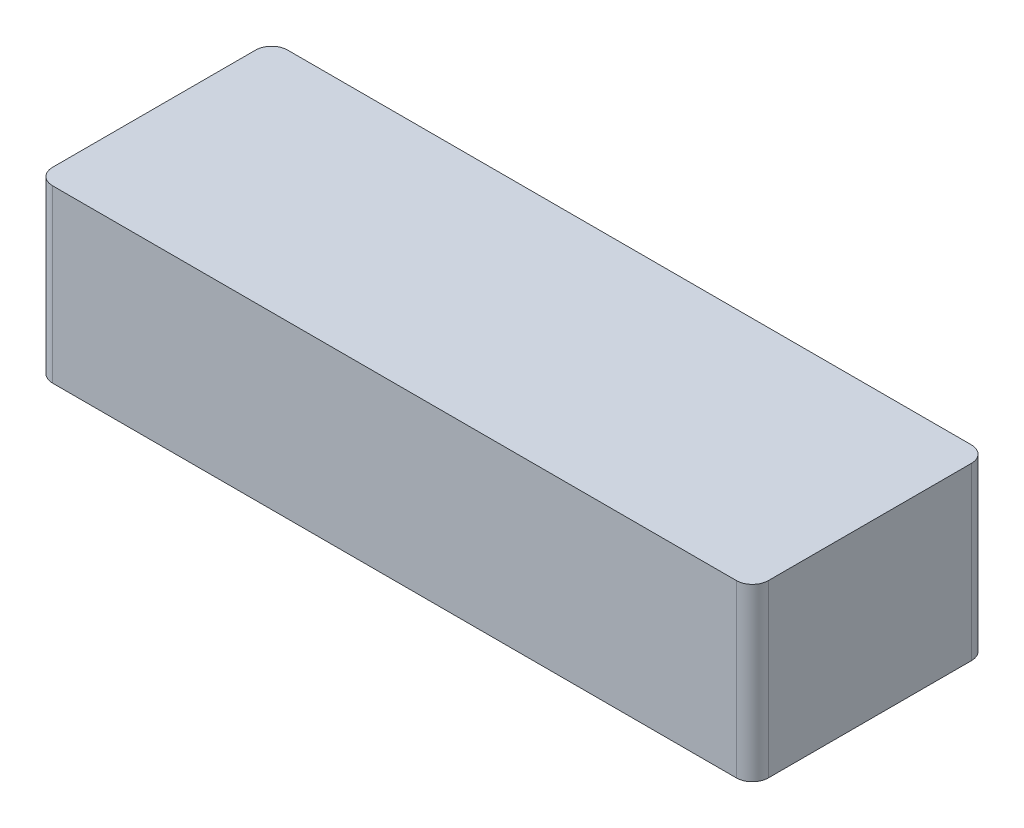
ISO-10303-21;
HEADER;
FILE_DESCRIPTION(('STEP AP214'),'2;1');
FILE_NAME('part.step','',(''),(''),'','','');
FILE_SCHEMA(('AUTOMOTIVE_DESIGN { 1 0 10303 214 1 1 1 1 }'));
ENDSEC;
DATA;
#1=APPLICATION_CONTEXT('core data for automotive mechanical design processes');
#2=APPLICATION_PROTOCOL_DEFINITION('international standard','automotive_design',2000,#1);
#3=PRODUCT_CONTEXT('',#1,'mechanical');
#4=PRODUCT('Part','Part','',(#3));
#5=PRODUCT_RELATED_PRODUCT_CATEGORY('part','',(#4));
#6=PRODUCT_DEFINITION_FORMATION('','',#4);
#7=PRODUCT_DEFINITION_CONTEXT('part definition',#1,'design');
#8=PRODUCT_DEFINITION('design','',#6,#7);
#9=PRODUCT_DEFINITION_SHAPE('','',#8);
#10=(LENGTH_UNIT() NAMED_UNIT(*) SI_UNIT(.MILLI.,.METRE.));
#11=(NAMED_UNIT(*) PLANE_ANGLE_UNIT() SI_UNIT($,.RADIAN.));
#12=(NAMED_UNIT(*) SI_UNIT($,.STERADIAN.) SOLID_ANGLE_UNIT());
#13=UNCERTAINTY_MEASURE_WITH_UNIT(LENGTH_MEASURE(1.E-05),#10,'distance_accuracy_value','');
#14=(GEOMETRIC_REPRESENTATION_CONTEXT(3) GLOBAL_UNCERTAINTY_ASSIGNED_CONTEXT((#13)) GLOBAL_UNIT_ASSIGNED_CONTEXT((#10,
#11,#12)) REPRESENTATION_CONTEXT('',''));
#15=CARTESIAN_POINT('',(0.,0.,0.));
#16=DIRECTION('',(0.,0.,1.));
#17=DIRECTION('',(1.,0.,0.));
#18=AXIS2_PLACEMENT_3D('',#15,#16,#17);
#19=CARTESIAN_POINT('',(-64.,32.,-19.));
#20=DIRECTION('',(0.,-1.,0.));
#21=DIRECTION('',(0.,0.,-1.));
#22=AXIS2_PLACEMENT_3D('',#19,#20,#21);
#23=CYLINDRICAL_SURFACE('',#22,3.);
#24=CARTESIAN_POINT('',(-64.,0.,-19.));
#25=DIRECTION('',(0.,1.,0.));
#26=DIRECTION('',(0.,0.,1.));
#27=AXIS2_PLACEMENT_3D('',#24,#25,#26);
#28=CIRCLE('',#27,3.);
#29=CARTESIAN_POINT('',(-64.,0.,-22.));
#30=VERTEX_POINT('',#29);
#31=CARTESIAN_POINT('',(-67.,0.,-19.));
#32=VERTEX_POINT('',#31);
#33=EDGE_CURVE('E137',#30,#32,#28,.T.);
#34=ORIENTED_EDGE('',*,*,#33,.T.);
#35=DIRECTION('',(0.,-1.,0.));
#36=VECTOR('',#35,1.);
#37=CARTESIAN_POINT('',(-67.,32.,-19.));
#38=LINE('',#37,#36);
#39=CARTESIAN_POINT('',(-67.,32.,-19.));
#40=VERTEX_POINT('',#39);
#41=EDGE_CURVE('E11',#40,#32,#38,.T.);
#42=ORIENTED_EDGE('',*,*,#41,.F.);
#43=CARTESIAN_POINT('',(-64.,32.,-19.));
#44=DIRECTION('',(0.,1.,0.));
#45=DIRECTION('',(0.,0.,1.));
#46=AXIS2_PLACEMENT_3D('',#43,#44,#45);
#47=CIRCLE('',#46,3.);
#48=CARTESIAN_POINT('',(-64.,32.,-22.));
#49=VERTEX_POINT('',#48);
#50=EDGE_CURVE('E157',#49,#40,#47,.T.);
#51=ORIENTED_EDGE('',*,*,#50,.F.);
#52=DIRECTION('',(0.,-1.,0.));
#53=VECTOR('',#52,1.);
#54=CARTESIAN_POINT('',(-64.,32.,-22.));
#55=LINE('',#54,#53);
#56=EDGE_CURVE('E56',#49,#30,#55,.T.);
#57=ORIENTED_EDGE('',*,*,#56,.T.);
#58=EDGE_LOOP('',(#34,#42,#51,#57));
#59=FACE_BOUND('',#58,.T.);
#60=ADVANCED_FACE('F43',(#59),#23,.T.);
#61=CARTESIAN_POINT('',(-67.,32.,-19.));
#62=DIRECTION('',(1.,0.,0.));
#63=DIRECTION('',(0.,0.,-1.));
#64=AXIS2_PLACEMENT_3D('',#61,#62,#63);
#65=PLANE('',#64);
#66=DIRECTION('',(0.,0.,1.));
#67=VECTOR('',#66,1.);
#68=CARTESIAN_POINT('',(-67.,0.,-19.));
#69=LINE('',#68,#67);
#70=CARTESIAN_POINT('',(-67.,0.,19.));
#71=VERTEX_POINT('',#70);
#72=EDGE_CURVE('E141',#32,#71,#69,.T.);
#73=ORIENTED_EDGE('',*,*,#72,.T.);
#74=DIRECTION('',(0.,-1.,0.));
#75=VECTOR('',#74,1.);
#76=CARTESIAN_POINT('',(-67.,32.,19.));
#77=LINE('',#76,#75);
#78=CARTESIAN_POINT('',(-67.,32.,19.));
#79=VERTEX_POINT('',#78);
#80=EDGE_CURVE('E51',#79,#71,#77,.T.);
#81=ORIENTED_EDGE('',*,*,#80,.F.);
#82=DIRECTION('',(0.,0.,1.));
#83=VECTOR('',#82,1.);
#84=CARTESIAN_POINT('',(-67.,32.,-19.));
#85=LINE('',#84,#83);
#86=EDGE_CURVE('E100',#40,#79,#85,.T.);
#87=ORIENTED_EDGE('',*,*,#86,.F.);
#88=ORIENTED_EDGE('',*,*,#41,.T.);
#89=EDGE_LOOP('',(#73,#81,#87,#88));
#90=FACE_BOUND('',#89,.T.);
#91=ADVANCED_FACE('F187',(#90),#65,.F.);
#92=CARTESIAN_POINT('',(-64.,32.,19.));
#93=DIRECTION('',(0.,-1.,0.));
#94=DIRECTION('',(0.,0.,-1.));
#95=AXIS2_PLACEMENT_3D('',#92,#93,#94);
#96=CYLINDRICAL_SURFACE('',#95,3.);
#97=CARTESIAN_POINT('',(-64.,0.,19.));
#98=DIRECTION('',(0.,1.,0.));
#99=DIRECTION('',(0.,0.,1.));
#100=AXIS2_PLACEMENT_3D('',#97,#98,#99);
#101=CIRCLE('',#100,3.);
#102=CARTESIAN_POINT('',(-64.,0.,22.));
#103=VERTEX_POINT('',#102);
#104=EDGE_CURVE('E142',#71,#103,#101,.T.);
#105=ORIENTED_EDGE('',*,*,#104,.T.);
#106=DIRECTION('',(0.,-1.,0.));
#107=VECTOR('',#106,1.);
#108=CARTESIAN_POINT('',(-64.,32.,22.));
#109=LINE('',#108,#107);
#110=CARTESIAN_POINT('',(-64.,32.,22.));
#111=VERTEX_POINT('',#110);
#112=EDGE_CURVE('E165',#111,#103,#109,.T.);
#113=ORIENTED_EDGE('',*,*,#112,.F.);
#114=CARTESIAN_POINT('',(-64.,32.,19.));
#115=DIRECTION('',(0.,1.,0.));
#116=DIRECTION('',(0.,0.,1.));
#117=AXIS2_PLACEMENT_3D('',#114,#115,#116);
#118=CIRCLE('',#117,3.);
#119=EDGE_CURVE('E173',#79,#111,#118,.T.);
#120=ORIENTED_EDGE('',*,*,#119,.F.);
#121=ORIENTED_EDGE('',*,*,#80,.T.);
#122=EDGE_LOOP('',(#105,#113,#120,#121));
#123=FACE_BOUND('',#122,.T.);
#124=ADVANCED_FACE('F170',(#123),#96,.T.);
#125=CARTESIAN_POINT('',(-64.,32.,22.));
#126=DIRECTION('',(0.,0.,-1.));
#127=DIRECTION('',(-1.,0.,0.));
#128=AXIS2_PLACEMENT_3D('',#125,#126,#127);
#129=PLANE('',#128);
#130=DIRECTION('',(1.,0.,0.));
#131=VECTOR('',#130,1.);
#132=CARTESIAN_POINT('',(-64.,0.,22.));
#133=LINE('',#132,#131);
#134=CARTESIAN_POINT('',(64.,0.,22.));
#135=VERTEX_POINT('',#134);
#136=EDGE_CURVE('E144',#103,#135,#133,.T.);
#137=ORIENTED_EDGE('',*,*,#136,.T.);
#138=DIRECTION('',(0.,-1.,0.));
#139=VECTOR('',#138,1.);
#140=CARTESIAN_POINT('',(64.,32.,22.));
#141=LINE('',#140,#139);
#142=CARTESIAN_POINT('',(64.,32.,22.));
#143=VERTEX_POINT('',#142);
#144=EDGE_CURVE('E158',#143,#135,#141,.T.);
#145=ORIENTED_EDGE('',*,*,#144,.F.);
#146=DIRECTION('',(1.,0.,0.));
#147=VECTOR('',#146,1.);
#148=CARTESIAN_POINT('',(-64.,32.,22.));
#149=LINE('',#148,#147);
#150=EDGE_CURVE('E185',#111,#143,#149,.T.);
#151=ORIENTED_EDGE('',*,*,#150,.F.);
#152=ORIENTED_EDGE('',*,*,#112,.T.);
#153=EDGE_LOOP('',(#137,#145,#151,#152));
#154=FACE_BOUND('',#153,.T.);
#155=ADVANCED_FACE('F178',(#154),#129,.F.);
#156=CARTESIAN_POINT('',(64.,32.,19.));
#157=DIRECTION('',(0.,-1.,0.));
#158=DIRECTION('',(0.,0.,-1.));
#159=AXIS2_PLACEMENT_3D('',#156,#157,#158);
#160=CYLINDRICAL_SURFACE('',#159,3.);
#161=CARTESIAN_POINT('',(64.,0.,19.));
#162=DIRECTION('',(0.,1.,0.));
#163=DIRECTION('',(0.,0.,1.));
#164=AXIS2_PLACEMENT_3D('',#161,#162,#163);
#165=CIRCLE('',#164,3.);
#166=CARTESIAN_POINT('',(67.,0.,19.));
#167=VERTEX_POINT('',#166);
#168=EDGE_CURVE('E150',#135,#167,#165,.T.);
#169=ORIENTED_EDGE('',*,*,#168,.T.);
#170=DIRECTION('',(0.,-1.,0.));
#171=VECTOR('',#170,1.);
#172=CARTESIAN_POINT('',(67.,32.,19.));
#173=LINE('',#172,#171);
#174=CARTESIAN_POINT('',(67.,32.,19.));
#175=VERTEX_POINT('',#174);
#176=EDGE_CURVE('E122',#175,#167,#173,.T.);
#177=ORIENTED_EDGE('',*,*,#176,.F.);
#178=CARTESIAN_POINT('',(64.,32.,19.));
#179=DIRECTION('',(0.,1.,0.));
#180=DIRECTION('',(0.,0.,1.));
#181=AXIS2_PLACEMENT_3D('',#178,#179,#180);
#182=CIRCLE('',#181,3.);
#183=EDGE_CURVE('E127',#143,#175,#182,.T.);
#184=ORIENTED_EDGE('',*,*,#183,.F.);
#185=ORIENTED_EDGE('',*,*,#144,.T.);
#186=EDGE_LOOP('',(#169,#177,#184,#185));
#187=FACE_BOUND('',#186,.T.);
#188=ADVANCED_FACE('F181',(#187),#160,.T.);
#189=CARTESIAN_POINT('',(67.,32.,-19.));
#190=DIRECTION('',(1.,0.,0.));
#191=DIRECTION('',(0.,0.,-1.));
#192=AXIS2_PLACEMENT_3D('',#189,#190,#191);
#193=PLANE('',#192);
#194=DIRECTION('',(0.,0.,1.));
#195=VECTOR('',#194,1.);
#196=CARTESIAN_POINT('',(67.,0.,-19.));
#197=LINE('',#196,#195);
#198=CARTESIAN_POINT('',(67.,0.,-19.));
#199=VERTEX_POINT('',#198);
#200=EDGE_CURVE('E120',#199,#167,#197,.T.);
#201=ORIENTED_EDGE('',*,*,#200,.F.);
#202=DIRECTION('',(0.,-1.,0.));
#203=VECTOR('',#202,1.);
#204=CARTESIAN_POINT('',(67.,32.,-19.));
#205=LINE('',#204,#203);
#206=CARTESIAN_POINT('',(67.,32.,-19.));
#207=VERTEX_POINT('',#206);
#208=EDGE_CURVE('E111',#207,#199,#205,.T.);
#209=ORIENTED_EDGE('',*,*,#208,.F.);
#210=DIRECTION('',(0.,0.,1.));
#211=VECTOR('',#210,1.);
#212=CARTESIAN_POINT('',(67.,32.,-19.));
#213=LINE('',#212,#211);
#214=EDGE_CURVE('E117',#207,#175,#213,.T.);
#215=ORIENTED_EDGE('',*,*,#214,.T.);
#216=ORIENTED_EDGE('',*,*,#176,.T.);
#217=EDGE_LOOP('',(#201,#209,#215,#216));
#218=FACE_BOUND('',#217,.T.);
#219=ADVANCED_FACE('F113',(#218),#193,.T.);
#220=CARTESIAN_POINT('',(64.,32.,-19.));
#221=DIRECTION('',(0.,-1.,0.));
#222=DIRECTION('',(0.,0.,-1.));
#223=AXIS2_PLACEMENT_3D('',#220,#221,#222);
#224=CYLINDRICAL_SURFACE('',#223,3.);
#225=CARTESIAN_POINT('',(64.,0.,-19.));
#226=DIRECTION('',(0.,-1.,0.));
#227=DIRECTION('',(0.,0.,-1.));
#228=AXIS2_PLACEMENT_3D('',#225,#226,#227);
#229=CIRCLE('',#228,3.);
#230=CARTESIAN_POINT('',(64.,0.,-22.));
#231=VERTEX_POINT('',#230);
#232=EDGE_CURVE('E152',#231,#199,#229,.T.);
#233=ORIENTED_EDGE('',*,*,#232,.F.);
#234=DIRECTION('',(0.,-1.,0.));
#235=VECTOR('',#234,1.);
#236=CARTESIAN_POINT('',(64.,32.,-22.));
#237=LINE('',#236,#235);
#238=CARTESIAN_POINT('',(64.,32.,-22.));
#239=VERTEX_POINT('',#238);
#240=EDGE_CURVE('E82',#239,#231,#237,.T.);
#241=ORIENTED_EDGE('',*,*,#240,.F.);
#242=CARTESIAN_POINT('',(64.,32.,-19.));
#243=DIRECTION('',(0.,-1.,0.));
#244=DIRECTION('',(0.,0.,-1.));
#245=AXIS2_PLACEMENT_3D('',#242,#243,#244);
#246=CIRCLE('',#245,3.);
#247=EDGE_CURVE('E126',#239,#207,#246,.T.);
#248=ORIENTED_EDGE('',*,*,#247,.T.);
#249=ORIENTED_EDGE('',*,*,#208,.T.);
#250=EDGE_LOOP('',(#233,#241,#248,#249));
#251=FACE_BOUND('',#250,.T.);
#252=ADVANCED_FACE('F133',(#251),#224,.T.);
#253=CARTESIAN_POINT('',(-64.,32.,-22.));
#254=DIRECTION('',(0.,0.,-1.));
#255=DIRECTION('',(-1.,0.,0.));
#256=AXIS2_PLACEMENT_3D('',#253,#254,#255);
#257=PLANE('',#256);
#258=DIRECTION('',(1.,0.,0.));
#259=VECTOR('',#258,1.);
#260=CARTESIAN_POINT('',(-64.,0.,-22.));
#261=LINE('',#260,#259);
#262=EDGE_CURVE('E155',#30,#231,#261,.T.);
#263=ORIENTED_EDGE('',*,*,#262,.F.);
#264=ORIENTED_EDGE('',*,*,#56,.F.);
#265=DIRECTION('',(1.,0.,0.));
#266=VECTOR('',#265,1.);
#267=CARTESIAN_POINT('',(-64.,32.,-22.));
#268=LINE('',#267,#266);
#269=EDGE_CURVE('E132',#49,#239,#268,.T.);
#270=ORIENTED_EDGE('',*,*,#269,.T.);
#271=ORIENTED_EDGE('',*,*,#240,.T.);
#272=EDGE_LOOP('',(#263,#264,#270,#271));
#273=FACE_BOUND('',#272,.T.);
#274=ADVANCED_FACE('F204',(#273),#257,.T.);
#275=CARTESIAN_POINT('',(-64.,32.,-19.));
#276=DIRECTION('',(0.,1.,0.));
#277=DIRECTION('',(0.,0.,1.));
#278=AXIS2_PLACEMENT_3D('',#275,#276,#277);
#279=PLANE('',#278);
#280=ORIENTED_EDGE('',*,*,#50,.T.);
#281=ORIENTED_EDGE('',*,*,#86,.T.);
#282=ORIENTED_EDGE('',*,*,#119,.T.);
#283=ORIENTED_EDGE('',*,*,#150,.T.);
#284=ORIENTED_EDGE('',*,*,#183,.T.);
#285=ORIENTED_EDGE('',*,*,#214,.F.);
#286=ORIENTED_EDGE('',*,*,#247,.F.);
#287=ORIENTED_EDGE('',*,*,#269,.F.);
#288=EDGE_LOOP('',(#280,#281,#282,#283,#284,#285,#286,#287));
#289=FACE_BOUND('',#288,.T.);
#290=ADVANCED_FACE('F128',(#289),#279,.T.);
#291=CARTESIAN_POINT('',(-64.,0.,-19.));
#292=DIRECTION('',(0.,1.,0.));
#293=DIRECTION('',(0.,0.,1.));
#294=AXIS2_PLACEMENT_3D('',#291,#292,#293);
#295=PLANE('',#294);
#296=ORIENTED_EDGE('',*,*,#33,.F.);
#297=ORIENTED_EDGE('',*,*,#262,.T.);
#298=ORIENTED_EDGE('',*,*,#232,.T.);
#299=ORIENTED_EDGE('',*,*,#200,.T.);
#300=ORIENTED_EDGE('',*,*,#168,.F.);
#301=ORIENTED_EDGE('',*,*,#136,.F.);
#302=ORIENTED_EDGE('',*,*,#104,.F.);
#303=ORIENTED_EDGE('',*,*,#72,.F.);
#304=EDGE_LOOP('',(#296,#297,#298,#299,#300,#301,#302,#303));
#305=FACE_BOUND('',#304,.T.);
#306=ADVANCED_FACE('F174',(#305),#295,.F.);
#307=CLOSED_SHELL('',(#60,#91,#124,#155,#188,#219,#252,#274,#290,#306));
#308=MANIFOLD_SOLID_BREP('B2',#307);
#309=ADVANCED_BREP_SHAPE_REPRESENTATION('',(#18,#308),#14);
#310=SHAPE_DEFINITION_REPRESENTATION(#9,#309);
ENDSEC;
END-ISO-10303-21;
